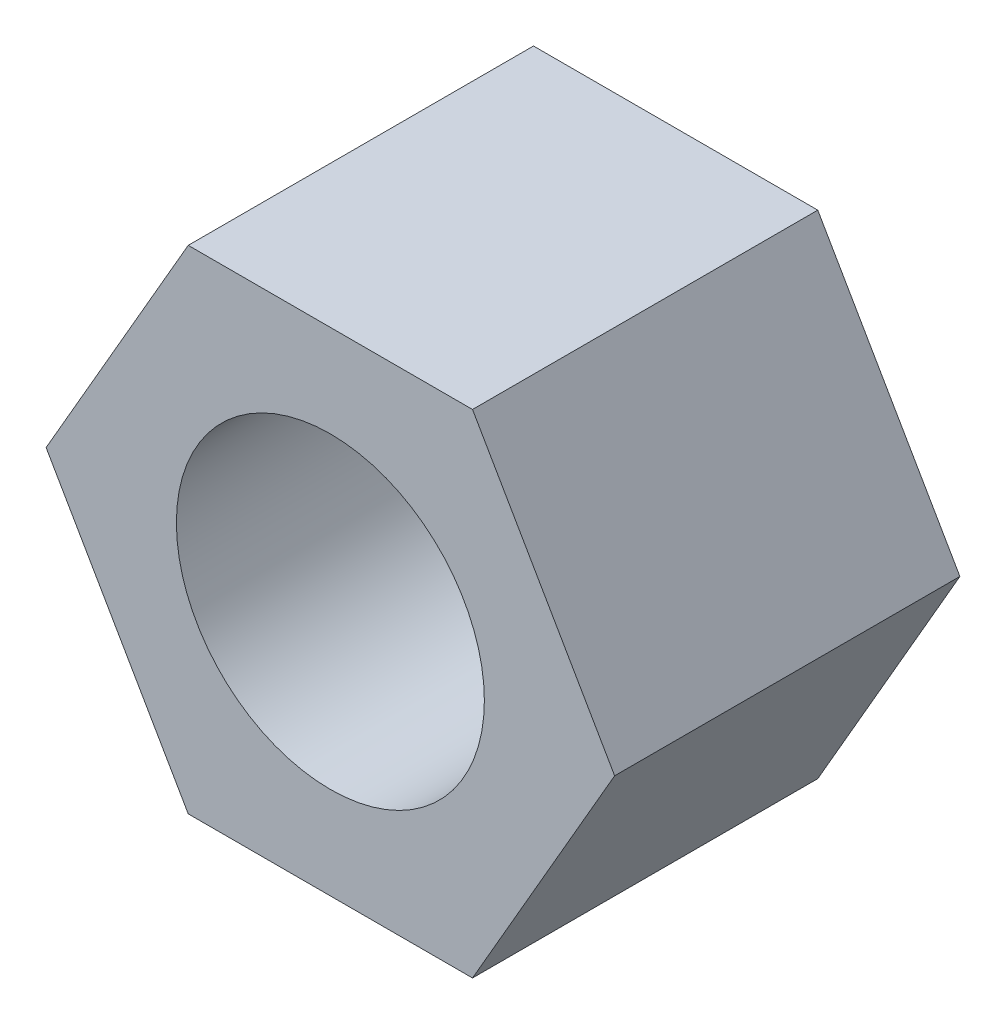
ISO-10303-21;
HEADER;
FILE_DESCRIPTION(('STEP AP214'),'2;1');
FILE_NAME('part.step','',(''),(''),'','','');
FILE_SCHEMA(('AUTOMOTIVE_DESIGN { 1 0 10303 214 1 1 1 1 }'));
ENDSEC;
DATA;
#1=APPLICATION_CONTEXT('core data for automotive mechanical design processes');
#2=APPLICATION_PROTOCOL_DEFINITION('international standard','automotive_design',2000,#1);
#3=PRODUCT_CONTEXT('',#1,'mechanical');
#4=PRODUCT('Part','Part','',(#3));
#5=PRODUCT_RELATED_PRODUCT_CATEGORY('part','',(#4));
#6=PRODUCT_DEFINITION_FORMATION('','',#4);
#7=PRODUCT_DEFINITION_CONTEXT('part definition',#1,'design');
#8=PRODUCT_DEFINITION('design','',#6,#7);
#9=PRODUCT_DEFINITION_SHAPE('','',#8);
#10=(LENGTH_UNIT() NAMED_UNIT(*) SI_UNIT(.MILLI.,.METRE.));
#11=(NAMED_UNIT(*) PLANE_ANGLE_UNIT() SI_UNIT($,.RADIAN.));
#12=(NAMED_UNIT(*) SI_UNIT($,.STERADIAN.) SOLID_ANGLE_UNIT());
#13=UNCERTAINTY_MEASURE_WITH_UNIT(LENGTH_MEASURE(1.E-05),#10,'distance_accuracy_value','');
#14=(GEOMETRIC_REPRESENTATION_CONTEXT(3) GLOBAL_UNCERTAINTY_ASSIGNED_CONTEXT((#13)) GLOBAL_UNIT_ASSIGNED_CONTEXT((#10,
#11,#12)) REPRESENTATION_CONTEXT('',''));
#15=CARTESIAN_POINT('',(0.,0.,0.));
#16=DIRECTION('',(0.,0.,1.));
#17=DIRECTION('',(1.,0.,0.));
#18=AXIS2_PLACEMENT_3D('',#15,#16,#17);
#19=CARTESIAN_POINT('',(0.,0.,8.8));
#20=DIRECTION('',(0.,0.,1.));
#21=DIRECTION('',(1.,0.,0.));
#22=AXIS2_PLACEMENT_3D('',#19,#20,#21);
#23=PLANE('',#22);
#24=DIRECTION('',(1.,0.,0.));
#25=VECTOR('',#24,1.);
#26=CARTESIAN_POINT('',(-3.6228729391649,-6.275,8.8));
#27=LINE('',#26,#25);
#28=CARTESIAN_POINT('',(-3.6228729391649,-6.275,8.8));
#29=VERTEX_POINT('',#28);
#30=CARTESIAN_POINT('',(3.6228729391649,-6.275,8.8));
#31=VERTEX_POINT('',#30);
#32=EDGE_CURVE('E152',#29,#31,#27,.T.);
#33=ORIENTED_EDGE('',*,*,#32,.T.);
#34=DIRECTION('',(0.5,0.866025403784439,0.));
#35=VECTOR('',#34,1.);
#36=CARTESIAN_POINT('',(3.6228729391649,-6.275,8.8));
#37=LINE('',#36,#35);
#38=CARTESIAN_POINT('',(7.2457458783298,0.,8.8));
#39=VERTEX_POINT('',#38);
#40=EDGE_CURVE('E100',#31,#39,#37,.T.);
#41=ORIENTED_EDGE('',*,*,#40,.T.);
#42=DIRECTION('',(-0.5,0.866025403784438,0.));
#43=VECTOR('',#42,1.);
#44=CARTESIAN_POINT('',(7.2457458783298,0.,8.8));
#45=LINE('',#44,#43);
#46=CARTESIAN_POINT('',(3.6228729391649,6.275,8.8));
#47=VERTEX_POINT('',#46);
#48=EDGE_CURVE('E113',#39,#47,#45,.T.);
#49=ORIENTED_EDGE('',*,*,#48,.T.);
#50=DIRECTION('',(-1.,0.,0.));
#51=VECTOR('',#50,1.);
#52=CARTESIAN_POINT('',(3.6228729391649,6.275,8.8));
#53=LINE('',#52,#51);
#54=CARTESIAN_POINT('',(-3.6228729391649,6.275,8.8));
#55=VERTEX_POINT('',#54);
#56=EDGE_CURVE('E107',#47,#55,#53,.T.);
#57=ORIENTED_EDGE('',*,*,#56,.T.);
#58=DIRECTION('',(-0.5,-0.866025403784439,0.));
#59=VECTOR('',#58,1.);
#60=CARTESIAN_POINT('',(-3.6228729391649,6.275,8.8));
#61=LINE('',#60,#59);
#62=CARTESIAN_POINT('',(-7.2457458783298,0.,8.8));
#63=VERTEX_POINT('',#62);
#64=EDGE_CURVE('E111',#55,#63,#61,.T.);
#65=ORIENTED_EDGE('',*,*,#64,.T.);
#66=DIRECTION('',(0.5,-0.866025403784439,0.));
#67=VECTOR('',#66,1.);
#68=CARTESIAN_POINT('',(-7.2457458783298,0.,8.8));
#69=LINE('',#68,#67);
#70=EDGE_CURVE('E63',#63,#29,#69,.T.);
#71=ORIENTED_EDGE('',*,*,#70,.T.);
#72=EDGE_LOOP('',(#33,#41,#49,#57,#65,#71));
#73=FACE_BOUND('',#72,.T.);
#74=CARTESIAN_POINT('',(0.,0.,8.8));
#75=DIRECTION('',(0.,0.,1.));
#76=DIRECTION('',(1.,0.,0.));
#77=AXIS2_PLACEMENT_3D('',#74,#75,#76);
#78=CIRCLE('',#77,3.925);
#79=CARTESIAN_POINT('',(3.925,0.,8.8));
#80=VERTEX_POINT('',#79);
#81=EDGE_CURVE('E140',#80,#80,#78,.T.);
#82=ORIENTED_EDGE('',*,*,#81,.F.);
#83=EDGE_LOOP('',(#82));
#84=FACE_BOUND('',#83,.T.);
#85=ADVANCED_FACE('F45',(#73,#84),#23,.T.);
#86=CARTESIAN_POINT('',(0.,0.,0.));
#87=DIRECTION('',(0.,0.,1.));
#88=DIRECTION('',(1.,0.,0.));
#89=AXIS2_PLACEMENT_3D('',#86,#87,#88);
#90=PLANE('',#89);
#91=DIRECTION('',(1.,0.,0.));
#92=VECTOR('',#91,1.);
#93=CARTESIAN_POINT('',(-3.6228729391649,-6.275,0.));
#94=LINE('',#93,#92);
#95=CARTESIAN_POINT('',(-3.6228729391649,-6.275,0.));
#96=VERTEX_POINT('',#95);
#97=CARTESIAN_POINT('',(3.6228729391649,-6.275,0.));
#98=VERTEX_POINT('',#97);
#99=EDGE_CURVE('E135',#96,#98,#94,.T.);
#100=ORIENTED_EDGE('',*,*,#99,.F.);
#101=DIRECTION('',(0.5,-0.866025403784439,0.));
#102=VECTOR('',#101,1.);
#103=CARTESIAN_POINT('',(-7.2457458783298,0.,0.));
#104=LINE('',#103,#102);
#105=CARTESIAN_POINT('',(-7.2457458783298,0.,0.));
#106=VERTEX_POINT('',#105);
#107=EDGE_CURVE('E92',#106,#96,#104,.T.);
#108=ORIENTED_EDGE('',*,*,#107,.F.);
#109=DIRECTION('',(-0.5,-0.866025403784439,0.));
#110=VECTOR('',#109,1.);
#111=CARTESIAN_POINT('',(-3.6228729391649,6.275,0.));
#112=LINE('',#111,#110);
#113=CARTESIAN_POINT('',(-3.6228729391649,6.275,0.));
#114=VERTEX_POINT('',#113);
#115=EDGE_CURVE('E86',#114,#106,#112,.T.);
#116=ORIENTED_EDGE('',*,*,#115,.F.);
#117=DIRECTION('',(-1.,0.,0.));
#118=VECTOR('',#117,1.);
#119=CARTESIAN_POINT('',(3.6228729391649,6.275,0.));
#120=LINE('',#119,#118);
#121=CARTESIAN_POINT('',(3.6228729391649,6.275,0.));
#122=VERTEX_POINT('',#121);
#123=EDGE_CURVE('E122',#122,#114,#120,.T.);
#124=ORIENTED_EDGE('',*,*,#123,.F.);
#125=DIRECTION('',(-0.5,0.866025403784438,0.));
#126=VECTOR('',#125,1.);
#127=CARTESIAN_POINT('',(7.2457458783298,0.,0.));
#128=LINE('',#127,#126);
#129=CARTESIAN_POINT('',(7.2457458783298,0.,0.));
#130=VERTEX_POINT('',#129);
#131=EDGE_CURVE('E143',#130,#122,#128,.T.);
#132=ORIENTED_EDGE('',*,*,#131,.F.);
#133=DIRECTION('',(0.5,0.866025403784439,0.));
#134=VECTOR('',#133,1.);
#135=CARTESIAN_POINT('',(3.6228729391649,-6.275,0.));
#136=LINE('',#135,#134);
#137=EDGE_CURVE('E139',#98,#130,#136,.T.);
#138=ORIENTED_EDGE('',*,*,#137,.F.);
#139=EDGE_LOOP('',(#100,#108,#116,#124,#132,#138));
#140=FACE_BOUND('',#139,.T.);
#141=CARTESIAN_POINT('',(0.,0.,0.));
#142=DIRECTION('',(0.,0.,1.));
#143=DIRECTION('',(1.,0.,0.));
#144=AXIS2_PLACEMENT_3D('',#141,#142,#143);
#145=CIRCLE('',#144,3.925);
#146=CARTESIAN_POINT('',(3.925,0.,0.));
#147=VERTEX_POINT('',#146);
#148=EDGE_CURVE('E249',#147,#147,#145,.T.);
#149=ORIENTED_EDGE('',*,*,#148,.T.);
#150=EDGE_LOOP('',(#149));
#151=FACE_BOUND('',#150,.T.);
#152=ADVANCED_FACE('F165',(#140,#151),#90,.F.);
#153=CARTESIAN_POINT('',(-3.6228729391649,-6.275,8.8));
#154=DIRECTION('',(0.,1.,0.));
#155=DIRECTION('',(0.,0.,1.));
#156=AXIS2_PLACEMENT_3D('',#153,#154,#155);
#157=PLANE('',#156);
#158=ORIENTED_EDGE('',*,*,#99,.T.);
#159=DIRECTION('',(0.,0.,-1.));
#160=VECTOR('',#159,1.);
#161=CARTESIAN_POINT('',(3.6228729391649,-6.275,8.8));
#162=LINE('',#161,#160);
#163=EDGE_CURVE('E11',#31,#98,#162,.T.);
#164=ORIENTED_EDGE('',*,*,#163,.F.);
#165=ORIENTED_EDGE('',*,*,#32,.F.);
#166=DIRECTION('',(0.,0.,-1.));
#167=VECTOR('',#166,1.);
#168=CARTESIAN_POINT('',(-3.6228729391649,-6.275,8.8));
#169=LINE('',#168,#167);
#170=EDGE_CURVE('E131',#29,#96,#169,.T.);
#171=ORIENTED_EDGE('',*,*,#170,.T.);
#172=EDGE_LOOP('',(#158,#164,#165,#171));
#173=FACE_BOUND('',#172,.T.);
#174=ADVANCED_FACE('F47',(#173),#157,.F.);
#175=CARTESIAN_POINT('',(3.6228729391649,-6.275,8.8));
#176=DIRECTION('',(-0.866025403784439,0.5,0.));
#177=DIRECTION('',(-0.5,-0.866025403784439,0.));
#178=AXIS2_PLACEMENT_3D('',#175,#176,#177);
#179=PLANE('',#178);
#180=ORIENTED_EDGE('',*,*,#137,.T.);
#181=DIRECTION('',(0.,0.,-1.));
#182=VECTOR('',#181,1.);
#183=CARTESIAN_POINT('',(7.2457458783298,0.,8.8));
#184=LINE('',#183,#182);
#185=EDGE_CURVE('E55',#39,#130,#184,.T.);
#186=ORIENTED_EDGE('',*,*,#185,.F.);
#187=ORIENTED_EDGE('',*,*,#40,.F.);
#188=ORIENTED_EDGE('',*,*,#163,.T.);
#189=EDGE_LOOP('',(#180,#186,#187,#188));
#190=FACE_BOUND('',#189,.T.);
#191=ADVANCED_FACE('F190',(#190),#179,.F.);
#192=CARTESIAN_POINT('',(7.2457458783298,0.,8.8));
#193=DIRECTION('',(-0.866025403784439,-0.5,0.));
#194=DIRECTION('',(0.5,-0.866025403784438,0.));
#195=AXIS2_PLACEMENT_3D('',#192,#193,#194);
#196=PLANE('',#195);
#197=ORIENTED_EDGE('',*,*,#131,.T.);
#198=DIRECTION('',(0.,0.,-1.));
#199=VECTOR('',#198,1.);
#200=CARTESIAN_POINT('',(3.6228729391649,6.275,8.8));
#201=LINE('',#200,#199);
#202=EDGE_CURVE('E124',#47,#122,#201,.T.);
#203=ORIENTED_EDGE('',*,*,#202,.F.);
#204=ORIENTED_EDGE('',*,*,#48,.F.);
#205=ORIENTED_EDGE('',*,*,#185,.T.);
#206=EDGE_LOOP('',(#197,#203,#204,#205));
#207=FACE_BOUND('',#206,.T.);
#208=ADVANCED_FACE('F162',(#207),#196,.F.);
#209=CARTESIAN_POINT('',(3.6228729391649,6.275,8.8));
#210=DIRECTION('',(0.,-1.,0.));
#211=DIRECTION('',(1.,0.,0.));
#212=AXIS2_PLACEMENT_3D('',#209,#210,#211);
#213=PLANE('',#212);
#214=ORIENTED_EDGE('',*,*,#123,.T.);
#215=DIRECTION('',(0.,0.,-1.));
#216=VECTOR('',#215,1.);
#217=CARTESIAN_POINT('',(-3.6228729391649,6.275,8.8));
#218=LINE('',#217,#216);
#219=EDGE_CURVE('E119',#55,#114,#218,.T.);
#220=ORIENTED_EDGE('',*,*,#219,.F.);
#221=ORIENTED_EDGE('',*,*,#56,.F.);
#222=ORIENTED_EDGE('',*,*,#202,.T.);
#223=EDGE_LOOP('',(#214,#220,#221,#222));
#224=FACE_BOUND('',#223,.T.);
#225=ADVANCED_FACE('F120',(#224),#213,.F.);
#226=CARTESIAN_POINT('',(-3.6228729391649,6.275,8.8));
#227=DIRECTION('',(0.866025403784439,-0.5,0.));
#228=DIRECTION('',(0.5,0.866025403784439,0.));
#229=AXIS2_PLACEMENT_3D('',#226,#227,#228);
#230=PLANE('',#229);
#231=ORIENTED_EDGE('',*,*,#115,.T.);
#232=DIRECTION('',(0.,0.,-1.));
#233=VECTOR('',#232,1.);
#234=CARTESIAN_POINT('',(-7.2457458783298,0.,8.8));
#235=LINE('',#234,#233);
#236=EDGE_CURVE('E125',#63,#106,#235,.T.);
#237=ORIENTED_EDGE('',*,*,#236,.F.);
#238=ORIENTED_EDGE('',*,*,#64,.F.);
#239=ORIENTED_EDGE('',*,*,#219,.T.);
#240=EDGE_LOOP('',(#231,#237,#238,#239));
#241=FACE_BOUND('',#240,.T.);
#242=ADVANCED_FACE('F127',(#241),#230,.F.);
#243=CARTESIAN_POINT('',(-7.2457458783298,0.,8.8));
#244=DIRECTION('',(0.866025403784438,0.5,0.));
#245=DIRECTION('',(-0.5,0.866025403784439,0.));
#246=AXIS2_PLACEMENT_3D('',#243,#244,#245);
#247=PLANE('',#246);
#248=ORIENTED_EDGE('',*,*,#107,.T.);
#249=ORIENTED_EDGE('',*,*,#170,.F.);
#250=ORIENTED_EDGE('',*,*,#70,.F.);
#251=ORIENTED_EDGE('',*,*,#236,.T.);
#252=EDGE_LOOP('',(#248,#249,#250,#251));
#253=FACE_BOUND('',#252,.T.);
#254=ADVANCED_FACE('F170',(#253),#247,.F.);
#255=CARTESIAN_POINT('',(0.,0.,8.8));
#256=DIRECTION('',(0.,0.,-1.));
#257=DIRECTION('',(-1.,0.,0.));
#258=AXIS2_PLACEMENT_3D('',#255,#256,#257);
#259=CYLINDRICAL_SURFACE('',#258,3.925);
#260=ORIENTED_EDGE('',*,*,#81,.T.);
#261=EDGE_LOOP('',(#260));
#262=FACE_BOUND('',#261,.T.);
#263=ORIENTED_EDGE('',*,*,#148,.F.);
#264=EDGE_LOOP('',(#263));
#265=FACE_BOUND('',#264,.T.);
#266=ADVANCED_FACE('F172',(#262,#265),#259,.F.);
#267=CLOSED_SHELL('',(#85,#152,#174,#191,#208,#225,#242,#254,#266));
#268=MANIFOLD_SOLID_BREP('B2',#267);
#269=ADVANCED_BREP_SHAPE_REPRESENTATION('',(#18,#268),#14);
#270=SHAPE_DEFINITION_REPRESENTATION(#9,#269);
ENDSEC;
END-ISO-10303-21;
